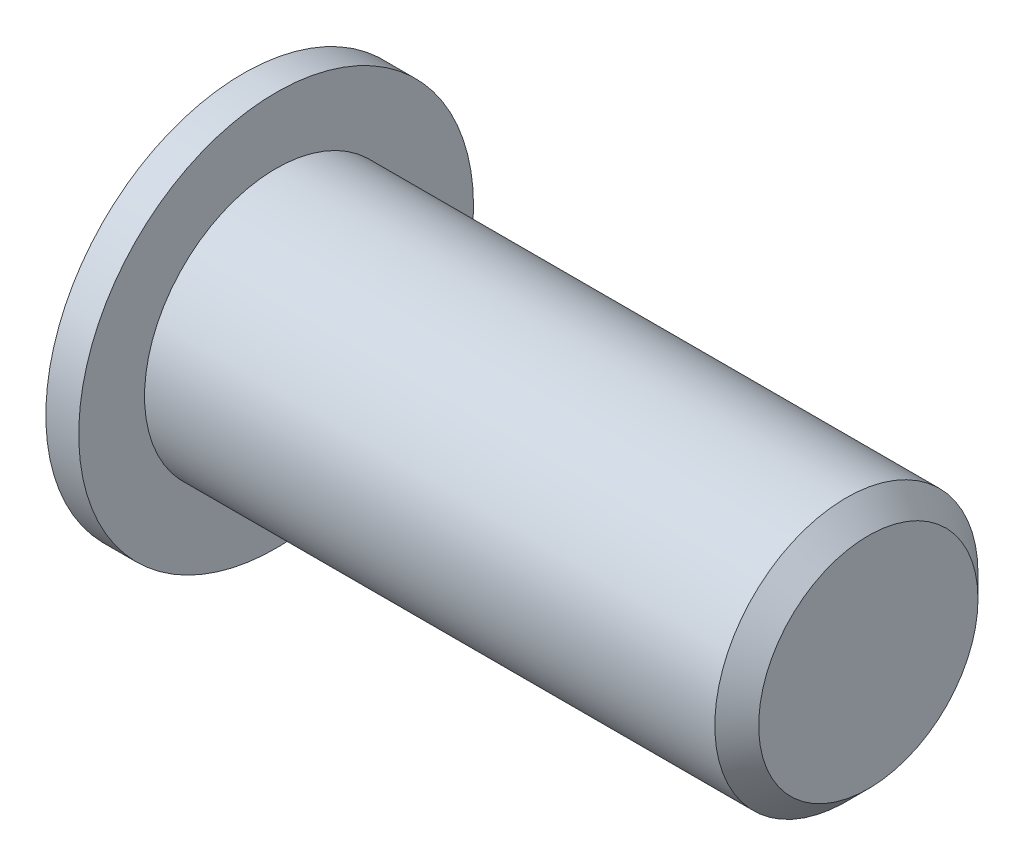
ISO-10303-21;
HEADER;
FILE_DESCRIPTION(('STEP AP214'),'2;1');
FILE_NAME('part.step','',(''),(''),'','','');
FILE_SCHEMA(('AUTOMOTIVE_DESIGN { 1 0 10303 214 1 1 1 1 }'));
ENDSEC;
DATA;
#1=APPLICATION_CONTEXT('core data for automotive mechanical design processes');
#2=APPLICATION_PROTOCOL_DEFINITION('international standard','automotive_design',2000,#1);
#3=PRODUCT_CONTEXT('',#1,'mechanical');
#4=PRODUCT('Part','Part','',(#3));
#5=PRODUCT_RELATED_PRODUCT_CATEGORY('part','',(#4));
#6=PRODUCT_DEFINITION_FORMATION('','',#4);
#7=PRODUCT_DEFINITION_CONTEXT('part definition',#1,'design');
#8=PRODUCT_DEFINITION('design','',#6,#7);
#9=PRODUCT_DEFINITION_SHAPE('','',#8);
#10=(LENGTH_UNIT() NAMED_UNIT(*) SI_UNIT(.MILLI.,.METRE.));
#11=(NAMED_UNIT(*) PLANE_ANGLE_UNIT() SI_UNIT($,.RADIAN.));
#12=(NAMED_UNIT(*) SI_UNIT($,.STERADIAN.) SOLID_ANGLE_UNIT());
#13=UNCERTAINTY_MEASURE_WITH_UNIT(LENGTH_MEASURE(1.E-05),#10,'distance_accuracy_value','');
#14=(GEOMETRIC_REPRESENTATION_CONTEXT(3) GLOBAL_UNCERTAINTY_ASSIGNED_CONTEXT((#13)) GLOBAL_UNIT_ASSIGNED_CONTEXT((#10,
#11,#12)) REPRESENTATION_CONTEXT('',''));
#15=CARTESIAN_POINT('',(0.,0.,0.));
#16=DIRECTION('',(0.,0.,1.));
#17=DIRECTION('',(1.,0.,0.));
#18=AXIS2_PLACEMENT_3D('',#15,#16,#17);
#19=CARTESIAN_POINT('',(0.,0.,3.));
#20=DIRECTION('',(-1.,0.,0.));
#21=DIRECTION('',(0.,0.,1.));
#22=AXIS2_PLACEMENT_3D('',#19,#20,#21);
#23=PLANE('',#22);
#24=CARTESIAN_POINT('',(0.,0.,3.));
#25=DIRECTION('',(1.,0.,0.));
#26=DIRECTION('',(0.,0.,-1.));
#27=AXIS2_PLACEMENT_3D('',#24,#25,#26);
#28=CIRCLE('',#27,3.);
#29=CARTESIAN_POINT('',(0.,0.,0.));
#30=VERTEX_POINT('',#29);
#31=EDGE_CURVE('E50',#30,#30,#28,.T.);
#32=ORIENTED_EDGE('',*,*,#31,.F.);
#33=EDGE_LOOP('',(#32));
#34=FACE_BOUND('',#33,.T.);
#35=ADVANCED_FACE('F37',(#34),#23,.T.);
#36=CARTESIAN_POINT('',(9.5,0.,3.));
#37=DIRECTION('',(1.,0.,0.));
#38=DIRECTION('',(0.,0.,-1.));
#39=AXIS2_PLACEMENT_3D('',#36,#37,#38);
#40=CYLINDRICAL_SURFACE('',#39,3.);
#41=ORIENTED_EDGE('',*,*,#31,.T.);
#42=EDGE_LOOP('',(#41));
#43=FACE_BOUND('',#42,.T.);
#44=CARTESIAN_POINT('',(0.5,0.,3.));
#45=DIRECTION('',(1.,0.,0.));
#46=DIRECTION('',(0.,0.,-1.));
#47=AXIS2_PLACEMENT_3D('',#44,#45,#46);
#48=CIRCLE('',#47,3.);
#49=CARTESIAN_POINT('',(0.5,0.,0.));
#50=VERTEX_POINT('',#49);
#51=EDGE_CURVE('E55',#50,#50,#48,.T.);
#52=ORIENTED_EDGE('',*,*,#51,.F.);
#53=EDGE_LOOP('',(#52));
#54=FACE_BOUND('',#53,.T.);
#55=ADVANCED_FACE('F70',(#43,#54),#40,.T.);
#56=CARTESIAN_POINT('',(0.5,0.,0.));
#57=DIRECTION('',(1.,0.,0.));
#58=DIRECTION('',(0.,0.,-1.));
#59=AXIS2_PLACEMENT_3D('',#56,#57,#58);
#60=PLANE('',#59);
#61=ORIENTED_EDGE('',*,*,#51,.T.);
#62=EDGE_LOOP('',(#61));
#63=FACE_BOUND('',#62,.T.);
#64=CARTESIAN_POINT('',(0.5,0.,3.));
#65=DIRECTION('',(1.,0.,0.));
#66=DIRECTION('',(0.,0.,-1.));
#67=AXIS2_PLACEMENT_3D('',#64,#65,#66);
#68=CIRCLE('',#67,2.);
#69=CARTESIAN_POINT('',(0.5,0.,0.999999999999999));
#70=VERTEX_POINT('',#69);
#71=EDGE_CURVE('E61',#70,#70,#68,.T.);
#72=ORIENTED_EDGE('',*,*,#71,.F.);
#73=EDGE_LOOP('',(#72));
#74=FACE_BOUND('',#73,.T.);
#75=ADVANCED_FACE('F68',(#63,#74),#60,.T.);
#76=CARTESIAN_POINT('',(9.5,0.,3.));
#77=DIRECTION('',(1.,0.,0.));
#78=DIRECTION('',(0.,0.,-1.));
#79=AXIS2_PLACEMENT_3D('',#76,#77,#78);
#80=CYLINDRICAL_SURFACE('',#79,2.);
#81=CARTESIAN_POINT('',(9.16666666666666,0.,3.));
#82=DIRECTION('',(1.,0.,0.));
#83=DIRECTION('',(0.,0.,-1.));
#84=AXIS2_PLACEMENT_3D('',#81,#82,#83);
#85=CIRCLE('',#84,2.);
#86=CARTESIAN_POINT('',(9.16666666666666,0.,0.999999999999998));
#87=VERTEX_POINT('',#86);
#88=EDGE_CURVE('E10',#87,#87,#85,.F.);
#89=ORIENTED_EDGE('',*,*,#88,.T.);
#90=EDGE_LOOP('',(#89));
#91=FACE_BOUND('',#90,.T.);
#92=ORIENTED_EDGE('',*,*,#71,.T.);
#93=EDGE_LOOP('',(#92));
#94=FACE_BOUND('',#93,.T.);
#95=ADVANCED_FACE('F66',(#91,#94),#80,.T.);
#96=CARTESIAN_POINT('',(9.5,0.,0.999999999999999));
#97=DIRECTION('',(1.,0.,0.));
#98=DIRECTION('',(0.,0.,-1.));
#99=AXIS2_PLACEMENT_3D('',#96,#97,#98);
#100=PLANE('',#99);
#101=CARTESIAN_POINT('',(9.5,0.,3.));
#102=DIRECTION('',(1.,0.,0.));
#103=DIRECTION('',(0.,0.,-1.));
#104=AXIS2_PLACEMENT_3D('',#101,#102,#103);
#105=CIRCLE('',#104,1.66666666666666);
#106=CARTESIAN_POINT('',(9.5,0.,1.33333333333333));
#107=VERTEX_POINT('',#106);
#108=EDGE_CURVE('E45',#107,#107,#105,.T.);
#109=ORIENTED_EDGE('',*,*,#108,.T.);
#110=EDGE_LOOP('',(#109));
#111=FACE_BOUND('',#110,.T.);
#112=ADVANCED_FACE('F77',(#111),#100,.T.);
#113=CARTESIAN_POINT('',(9.5,0.,3.));
#114=DIRECTION('',(-1.,0.,0.));
#115=DIRECTION('',(0.,0.,1.));
#116=AXIS2_PLACEMENT_3D('',#113,#114,#115);
#117=CONICAL_SURFACE('',#116,1.66666666666666,0.785398163397449);
#118=ORIENTED_EDGE('',*,*,#88,.F.);
#119=EDGE_LOOP('',(#118));
#120=FACE_BOUND('',#119,.T.);
#121=ORIENTED_EDGE('',*,*,#108,.F.);
#122=EDGE_LOOP('',(#121));
#123=FACE_BOUND('',#122,.T.);
#124=ADVANCED_FACE('F39',(#120,#123),#117,.T.);
#125=CLOSED_SHELL('',(#35,#55,#75,#95,#112,#124));
#126=MANIFOLD_SOLID_BREP('B2',#125);
#127=ADVANCED_BREP_SHAPE_REPRESENTATION('',(#18,#126),#14);
#128=SHAPE_DEFINITION_REPRESENTATION(#9,#127);
ENDSEC;
END-ISO-10303-21;
